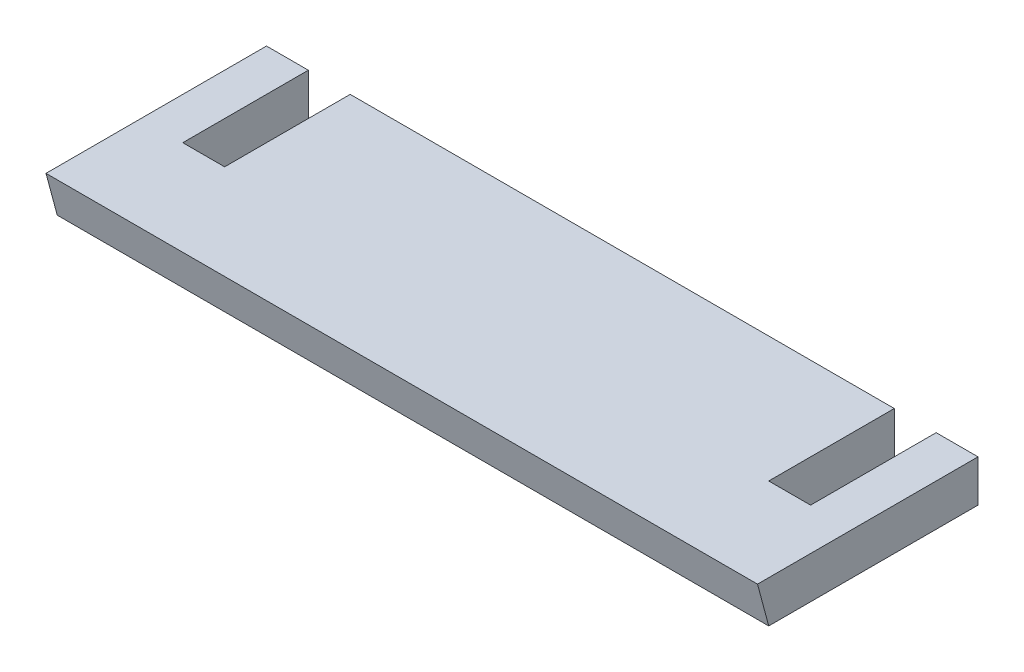
ISO-10303-21;
HEADER;
FILE_DESCRIPTION(('STEP AP214'),'2;1');
FILE_NAME('part.step','',(''),(''),'','','');
FILE_SCHEMA(('AUTOMOTIVE_DESIGN { 1 0 10303 214 1 1 1 1 }'));
ENDSEC;
DATA;
#1=APPLICATION_CONTEXT('core data for automotive mechanical design processes');
#2=APPLICATION_PROTOCOL_DEFINITION('international standard','automotive_design',2000,#1);
#3=PRODUCT_CONTEXT('',#1,'mechanical');
#4=PRODUCT('Part','Part','',(#3));
#5=PRODUCT_RELATED_PRODUCT_CATEGORY('part','',(#4));
#6=PRODUCT_DEFINITION_FORMATION('','',#4);
#7=PRODUCT_DEFINITION_CONTEXT('part definition',#1,'design');
#8=PRODUCT_DEFINITION('design','',#6,#7);
#9=PRODUCT_DEFINITION_SHAPE('','',#8);
#10=(LENGTH_UNIT() NAMED_UNIT(*) SI_UNIT(.MILLI.,.METRE.));
#11=(NAMED_UNIT(*) PLANE_ANGLE_UNIT() SI_UNIT($,.RADIAN.));
#12=(NAMED_UNIT(*) SI_UNIT($,.STERADIAN.) SOLID_ANGLE_UNIT());
#13=UNCERTAINTY_MEASURE_WITH_UNIT(LENGTH_MEASURE(1.E-05),#10,'distance_accuracy_value','');
#14=(GEOMETRIC_REPRESENTATION_CONTEXT(3) GLOBAL_UNCERTAINTY_ASSIGNED_CONTEXT((#13)) GLOBAL_UNIT_ASSIGNED_CONTEXT((#10,
#11,#12)) REPRESENTATION_CONTEXT('',''));
#15=CARTESIAN_POINT('',(0.,0.,0.));
#16=DIRECTION('',(0.,0.,1.));
#17=DIRECTION('',(1.,0.,0.));
#18=AXIS2_PLACEMENT_3D('',#15,#16,#17);
#19=CARTESIAN_POINT('',(-75.,10.,-25.));
#20=DIRECTION('',(0.,0.,1.));
#21=DIRECTION('',(1.,0.,0.));
#22=AXIS2_PLACEMENT_3D('',#19,#20,#21);
#23=PLANE('',#22);
#24=DIRECTION('',(-1.,0.,0.));
#25=VECTOR('',#24,1.);
#26=CARTESIAN_POINT('',(-75.,0.,-25.));
#27=LINE('',#26,#25);
#28=CARTESIAN_POINT('',(-75.,0.,-25.));
#29=VERTEX_POINT('',#28);
#30=CARTESIAN_POINT('',(-85.,0.,-25.));
#31=VERTEX_POINT('',#30);
#32=EDGE_CURVE('E162',#29,#31,#27,.T.);
#33=ORIENTED_EDGE('',*,*,#32,.T.);
#34=DIRECTION('',(0.,-1.,0.));
#35=VECTOR('',#34,1.);
#36=CARTESIAN_POINT('',(-85.,10.,-25.));
#37=LINE('',#36,#35);
#38=CARTESIAN_POINT('',(-85.,10.,-25.));
#39=VERTEX_POINT('',#38);
#40=EDGE_CURVE('E11',#39,#31,#37,.T.);
#41=ORIENTED_EDGE('',*,*,#40,.F.);
#42=DIRECTION('',(-1.,0.,0.));
#43=VECTOR('',#42,1.);
#44=CARTESIAN_POINT('',(-75.,10.,-25.));
#45=LINE('',#44,#43);
#46=CARTESIAN_POINT('',(-75.,10.,-25.));
#47=VERTEX_POINT('',#46);
#48=EDGE_CURVE('E198',#47,#39,#45,.T.);
#49=ORIENTED_EDGE('',*,*,#48,.F.);
#50=DIRECTION('',(0.,-1.,0.));
#51=VECTOR('',#50,1.);
#52=CARTESIAN_POINT('',(-75.,10.,-25.));
#53=LINE('',#52,#51);
#54=EDGE_CURVE('E158',#47,#29,#53,.T.);
#55=ORIENTED_EDGE('',*,*,#54,.T.);
#56=EDGE_LOOP('',(#33,#41,#49,#55));
#57=FACE_BOUND('',#56,.T.);
#58=ADVANCED_FACE('F39',(#57),#23,.F.);
#59=CARTESIAN_POINT('',(-85.,10.,25.));
#60=DIRECTION('',(1.,0.,0.));
#61=DIRECTION('',(0.,0.,-1.));
#62=AXIS2_PLACEMENT_3D('',#59,#60,#61);
#63=PLANE('',#62);
#64=DIRECTION('',(0.,0.,1.));
#65=VECTOR('',#64,1.);
#66=CARTESIAN_POINT('',(-85.,0.,25.));
#67=LINE('',#66,#65);
#68=CARTESIAN_POINT('',(-85.,0.,25.));
#69=VERTEX_POINT('',#68);
#70=EDGE_CURVE('E166',#31,#69,#67,.T.);
#71=ORIENTED_EDGE('',*,*,#70,.T.);
#72=DIRECTION('',(0.,0.965925826289068,0.258819045102521));
#73=VECTOR('',#72,1.);
#74=CARTESIAN_POINT('',(-85.,0.,25.));
#75=LINE('',#74,#73);
#76=CARTESIAN_POINT('',(-85.,10.,27.6794919243112));
#77=VERTEX_POINT('',#76);
#78=EDGE_CURVE('E50',#77,#69,#75,.F.);
#79=ORIENTED_EDGE('',*,*,#78,.F.);
#80=DIRECTION('',(0.,0.,1.));
#81=VECTOR('',#80,1.);
#82=CARTESIAN_POINT('',(-85.,10.,25.));
#83=LINE('',#82,#81);
#84=EDGE_CURVE('E105',#39,#77,#83,.T.);
#85=ORIENTED_EDGE('',*,*,#84,.F.);
#86=ORIENTED_EDGE('',*,*,#40,.T.);
#87=EDGE_LOOP('',(#71,#79,#85,#86));
#88=FACE_BOUND('',#87,.T.);
#89=ADVANCED_FACE('F271',(#88),#63,.F.);
#90=CARTESIAN_POINT('',(85.,0.,25.));
#91=DIRECTION('',(0.,-0.258819045102521,0.965925826289068));
#92=DIRECTION('',(0.,-0.965925826289068,-0.258819045102521));
#93=AXIS2_PLACEMENT_3D('',#90,#91,#92);
#94=PLANE('',#93);
#95=DIRECTION('',(1.,0.,0.));
#96=VECTOR('',#95,1.);
#97=CARTESIAN_POINT('',(85.,0.,25.));
#98=LINE('',#97,#96);
#99=CARTESIAN_POINT('',(85.,0.,25.));
#100=VERTEX_POINT('',#99);
#101=EDGE_CURVE('E169',#69,#100,#98,.T.);
#102=ORIENTED_EDGE('',*,*,#101,.T.);
#103=DIRECTION('',(0.,0.965925826289068,0.258819045102521));
#104=VECTOR('',#103,1.);
#105=CARTESIAN_POINT('',(85.,9.33012701892219,27.5));
#106=LINE('',#105,#104);
#107=CARTESIAN_POINT('',(85.,10.,27.6794919243112));
#108=VERTEX_POINT('',#107);
#109=EDGE_CURVE('E43',#108,#100,#106,.F.);
#110=ORIENTED_EDGE('',*,*,#109,.F.);
#111=DIRECTION('',(-1.,0.,0.));
#112=VECTOR('',#111,1.);
#113=CARTESIAN_POINT('',(0.,10.,27.6794919243112));
#114=LINE('',#113,#112);
#115=EDGE_CURVE('E228',#77,#108,#114,.F.);
#116=ORIENTED_EDGE('',*,*,#115,.F.);
#117=ORIENTED_EDGE('',*,*,#78,.T.);
#118=EDGE_LOOP('',(#102,#110,#116,#117));
#119=FACE_BOUND('',#118,.T.);
#120=ADVANCED_FACE('F41',(#119),#94,.T.);
#121=CARTESIAN_POINT('',(85.,10.,25.));
#122=DIRECTION('',(-1.,0.,0.));
#123=DIRECTION('',(0.,0.,1.));
#124=AXIS2_PLACEMENT_3D('',#121,#122,#123);
#125=PLANE('',#124);
#126=DIRECTION('',(0.,0.,-1.));
#127=VECTOR('',#126,1.);
#128=CARTESIAN_POINT('',(85.,0.,25.));
#129=LINE('',#128,#127);
#130=CARTESIAN_POINT('',(85.,0.,-25.));
#131=VERTEX_POINT('',#130);
#132=EDGE_CURVE('E172',#100,#131,#129,.T.);
#133=ORIENTED_EDGE('',*,*,#132,.T.);
#134=DIRECTION('',(0.,-1.,0.));
#135=VECTOR('',#134,1.);
#136=CARTESIAN_POINT('',(85.,10.,-25.));
#137=LINE('',#136,#135);
#138=CARTESIAN_POINT('',(85.,10.,-25.));
#139=VERTEX_POINT('',#138);
#140=EDGE_CURVE('E222',#139,#131,#137,.T.);
#141=ORIENTED_EDGE('',*,*,#140,.F.);
#142=DIRECTION('',(0.,0.,-1.));
#143=VECTOR('',#142,1.);
#144=CARTESIAN_POINT('',(85.,10.,25.));
#145=LINE('',#144,#143);
#146=EDGE_CURVE('E230',#108,#139,#145,.T.);
#147=ORIENTED_EDGE('',*,*,#146,.F.);
#148=ORIENTED_EDGE('',*,*,#109,.T.);
#149=EDGE_LOOP('',(#133,#141,#147,#148));
#150=FACE_BOUND('',#149,.T.);
#151=ADVANCED_FACE('F280',(#150),#125,.F.);
#152=CARTESIAN_POINT('',(85.,10.,-25.));
#153=DIRECTION('',(0.,0.,1.));
#154=DIRECTION('',(1.,0.,0.));
#155=AXIS2_PLACEMENT_3D('',#152,#153,#154);
#156=PLANE('',#155);
#157=DIRECTION('',(-1.,0.,0.));
#158=VECTOR('',#157,1.);
#159=CARTESIAN_POINT('',(85.,0.,-25.));
#160=LINE('',#159,#158);
#161=CARTESIAN_POINT('',(75.,0.,-25.));
#162=VERTEX_POINT('',#161);
#163=EDGE_CURVE('E175',#131,#162,#160,.T.);
#164=ORIENTED_EDGE('',*,*,#163,.T.);
#165=DIRECTION('',(0.,-1.,0.));
#166=VECTOR('',#165,1.);
#167=CARTESIAN_POINT('',(75.,10.,-25.));
#168=LINE('',#167,#166);
#169=CARTESIAN_POINT('',(75.,10.,-25.));
#170=VERTEX_POINT('',#169);
#171=EDGE_CURVE('E218',#170,#162,#168,.T.);
#172=ORIENTED_EDGE('',*,*,#171,.F.);
#173=DIRECTION('',(-1.,0.,0.));
#174=VECTOR('',#173,1.);
#175=CARTESIAN_POINT('',(85.,10.,-25.));
#176=LINE('',#175,#174);
#177=EDGE_CURVE('E235',#139,#170,#176,.T.);
#178=ORIENTED_EDGE('',*,*,#177,.F.);
#179=ORIENTED_EDGE('',*,*,#140,.T.);
#180=EDGE_LOOP('',(#164,#172,#178,#179));
#181=FACE_BOUND('',#180,.T.);
#182=ADVANCED_FACE('F284',(#181),#156,.F.);
#183=CARTESIAN_POINT('',(75.,10.,-25.));
#184=DIRECTION('',(1.,0.,0.));
#185=DIRECTION('',(0.,0.,-1.));
#186=AXIS2_PLACEMENT_3D('',#183,#184,#185);
#187=PLANE('',#186);
#188=DIRECTION('',(0.,0.,1.));
#189=VECTOR('',#188,1.);
#190=CARTESIAN_POINT('',(75.,0.,-25.));
#191=LINE('',#190,#189);
#192=CARTESIAN_POINT('',(75.,0.,5.));
#193=VERTEX_POINT('',#192);
#194=EDGE_CURVE('E178',#162,#193,#191,.T.);
#195=ORIENTED_EDGE('',*,*,#194,.T.);
#196=DIRECTION('',(0.,-1.,0.));
#197=VECTOR('',#196,1.);
#198=CARTESIAN_POINT('',(75.,10.,5.));
#199=LINE('',#198,#197);
#200=CARTESIAN_POINT('',(75.,10.,5.));
#201=VERTEX_POINT('',#200);
#202=EDGE_CURVE('E214',#201,#193,#199,.T.);
#203=ORIENTED_EDGE('',*,*,#202,.F.);
#204=DIRECTION('',(0.,0.,1.));
#205=VECTOR('',#204,1.);
#206=CARTESIAN_POINT('',(75.,10.,-25.));
#207=LINE('',#206,#205);
#208=EDGE_CURVE('E243',#170,#201,#207,.T.);
#209=ORIENTED_EDGE('',*,*,#208,.F.);
#210=ORIENTED_EDGE('',*,*,#171,.T.);
#211=EDGE_LOOP('',(#195,#203,#209,#210));
#212=FACE_BOUND('',#211,.T.);
#213=ADVANCED_FACE('F289',(#212),#187,.F.);
#214=CARTESIAN_POINT('',(75.,10.,5.));
#215=DIRECTION('',(0.,0.,1.));
#216=DIRECTION('',(1.,0.,0.));
#217=AXIS2_PLACEMENT_3D('',#214,#215,#216);
#218=PLANE('',#217);
#219=DIRECTION('',(-1.,0.,0.));
#220=VECTOR('',#219,1.);
#221=CARTESIAN_POINT('',(75.,0.,5.));
#222=LINE('',#221,#220);
#223=CARTESIAN_POINT('',(65.,0.,5.));
#224=VERTEX_POINT('',#223);
#225=EDGE_CURVE('E181',#193,#224,#222,.T.);
#226=ORIENTED_EDGE('',*,*,#225,.T.);
#227=DIRECTION('',(0.,-1.,0.));
#228=VECTOR('',#227,1.);
#229=CARTESIAN_POINT('',(65.,10.,5.));
#230=LINE('',#229,#228);
#231=CARTESIAN_POINT('',(65.,10.,5.));
#232=VERTEX_POINT('',#231);
#233=EDGE_CURVE('E210',#232,#224,#230,.T.);
#234=ORIENTED_EDGE('',*,*,#233,.F.);
#235=DIRECTION('',(-1.,0.,0.));
#236=VECTOR('',#235,1.);
#237=CARTESIAN_POINT('',(75.,10.,5.));
#238=LINE('',#237,#236);
#239=EDGE_CURVE('E246',#201,#232,#238,.T.);
#240=ORIENTED_EDGE('',*,*,#239,.F.);
#241=ORIENTED_EDGE('',*,*,#202,.T.);
#242=EDGE_LOOP('',(#226,#234,#240,#241));
#243=FACE_BOUND('',#242,.T.);
#244=ADVANCED_FACE('F292',(#243),#218,.F.);
#245=CARTESIAN_POINT('',(65.,10.,5.));
#246=DIRECTION('',(-1.,0.,0.));
#247=DIRECTION('',(0.,0.,1.));
#248=AXIS2_PLACEMENT_3D('',#245,#246,#247);
#249=PLANE('',#248);
#250=DIRECTION('',(0.,0.,-1.));
#251=VECTOR('',#250,1.);
#252=CARTESIAN_POINT('',(65.,0.,5.));
#253=LINE('',#252,#251);
#254=CARTESIAN_POINT('',(65.,0.,-25.));
#255=VERTEX_POINT('',#254);
#256=EDGE_CURVE('E184',#224,#255,#253,.T.);
#257=ORIENTED_EDGE('',*,*,#256,.T.);
#258=DIRECTION('',(0.,-1.,0.));
#259=VECTOR('',#258,1.);
#260=CARTESIAN_POINT('',(65.,10.,-25.));
#261=LINE('',#260,#259);
#262=CARTESIAN_POINT('',(65.,10.,-25.));
#263=VERTEX_POINT('',#262);
#264=EDGE_CURVE('E206',#263,#255,#261,.T.);
#265=ORIENTED_EDGE('',*,*,#264,.F.);
#266=DIRECTION('',(0.,0.,-1.));
#267=VECTOR('',#266,1.);
#268=CARTESIAN_POINT('',(65.,10.,5.));
#269=LINE('',#268,#267);
#270=EDGE_CURVE('E249',#232,#263,#269,.T.);
#271=ORIENTED_EDGE('',*,*,#270,.F.);
#272=ORIENTED_EDGE('',*,*,#233,.T.);
#273=EDGE_LOOP('',(#257,#265,#271,#272));
#274=FACE_BOUND('',#273,.T.);
#275=ADVANCED_FACE('F257',(#274),#249,.F.);
#276=CARTESIAN_POINT('',(65.,10.,-25.));
#277=DIRECTION('',(0.,0.,1.));
#278=DIRECTION('',(1.,0.,0.));
#279=AXIS2_PLACEMENT_3D('',#276,#277,#278);
#280=PLANE('',#279);
#281=DIRECTION('',(-1.,0.,0.));
#282=VECTOR('',#281,1.);
#283=CARTESIAN_POINT('',(65.,0.,-25.));
#284=LINE('',#283,#282);
#285=CARTESIAN_POINT('',(-65.,0.,-25.));
#286=VERTEX_POINT('',#285);
#287=EDGE_CURVE('E187',#255,#286,#284,.T.);
#288=ORIENTED_EDGE('',*,*,#287,.T.);
#289=DIRECTION('',(0.,-1.,0.));
#290=VECTOR('',#289,1.);
#291=CARTESIAN_POINT('',(-65.,10.,-25.));
#292=LINE('',#291,#290);
#293=CARTESIAN_POINT('',(-65.,10.,-25.));
#294=VERTEX_POINT('',#293);
#295=EDGE_CURVE('E150',#294,#286,#292,.T.);
#296=ORIENTED_EDGE('',*,*,#295,.F.);
#297=DIRECTION('',(-1.,0.,0.));
#298=VECTOR('',#297,1.);
#299=CARTESIAN_POINT('',(65.,10.,-25.));
#300=LINE('',#299,#298);
#301=EDGE_CURVE('E136',#263,#294,#300,.T.);
#302=ORIENTED_EDGE('',*,*,#301,.F.);
#303=ORIENTED_EDGE('',*,*,#264,.T.);
#304=EDGE_LOOP('',(#288,#296,#302,#303));
#305=FACE_BOUND('',#304,.T.);
#306=ADVANCED_FACE('F261',(#305),#280,.F.);
#307=CARTESIAN_POINT('',(-65.,10.,5.));
#308=DIRECTION('',(1.,0.,0.));
#309=DIRECTION('',(0.,0.,-1.));
#310=AXIS2_PLACEMENT_3D('',#307,#308,#309);
#311=PLANE('',#310);
#312=DIRECTION('',(0.,0.,1.));
#313=VECTOR('',#312,1.);
#314=CARTESIAN_POINT('',(-65.,0.,5.));
#315=LINE('',#314,#313);
#316=CARTESIAN_POINT('',(-65.,0.,5.));
#317=VERTEX_POINT('',#316);
#318=EDGE_CURVE('E146',#286,#317,#315,.T.);
#319=ORIENTED_EDGE('',*,*,#318,.T.);
#320=DIRECTION('',(0.,-1.,0.));
#321=VECTOR('',#320,1.);
#322=CARTESIAN_POINT('',(-65.,10.,5.));
#323=LINE('',#322,#321);
#324=CARTESIAN_POINT('',(-65.,10.,5.));
#325=VERTEX_POINT('',#324);
#326=EDGE_CURVE('E143',#325,#317,#323,.T.);
#327=ORIENTED_EDGE('',*,*,#326,.F.);
#328=DIRECTION('',(0.,0.,1.));
#329=VECTOR('',#328,1.);
#330=CARTESIAN_POINT('',(-65.,10.,5.));
#331=LINE('',#330,#329);
#332=EDGE_CURVE('E129',#294,#325,#331,.T.);
#333=ORIENTED_EDGE('',*,*,#332,.F.);
#334=ORIENTED_EDGE('',*,*,#295,.T.);
#335=EDGE_LOOP('',(#319,#327,#333,#334));
#336=FACE_BOUND('',#335,.T.);
#337=ADVANCED_FACE('F144',(#336),#311,.F.);
#338=CARTESIAN_POINT('',(-75.,10.,5.));
#339=DIRECTION('',(0.,0.,1.));
#340=DIRECTION('',(1.,0.,0.));
#341=AXIS2_PLACEMENT_3D('',#338,#339,#340);
#342=PLANE('',#341);
#343=DIRECTION('',(-1.,0.,0.));
#344=VECTOR('',#343,1.);
#345=CARTESIAN_POINT('',(-75.,0.,5.));
#346=LINE('',#345,#344);
#347=CARTESIAN_POINT('',(-75.,0.,5.));
#348=VERTEX_POINT('',#347);
#349=EDGE_CURVE('E192',#317,#348,#346,.T.);
#350=ORIENTED_EDGE('',*,*,#349,.T.);
#351=DIRECTION('',(0.,-1.,0.));
#352=VECTOR('',#351,1.);
#353=CARTESIAN_POINT('',(-75.,10.,5.));
#354=LINE('',#353,#352);
#355=CARTESIAN_POINT('',(-75.,10.,5.));
#356=VERTEX_POINT('',#355);
#357=EDGE_CURVE('E151',#356,#348,#354,.T.);
#358=ORIENTED_EDGE('',*,*,#357,.F.);
#359=DIRECTION('',(-1.,0.,0.));
#360=VECTOR('',#359,1.);
#361=CARTESIAN_POINT('',(-75.,10.,5.));
#362=LINE('',#361,#360);
#363=EDGE_CURVE('E133',#325,#356,#362,.T.);
#364=ORIENTED_EDGE('',*,*,#363,.F.);
#365=ORIENTED_EDGE('',*,*,#326,.T.);
#366=EDGE_LOOP('',(#350,#358,#364,#365));
#367=FACE_BOUND('',#366,.T.);
#368=ADVANCED_FACE('F153',(#367),#342,.F.);
#369=CARTESIAN_POINT('',(-75.,10.,-25.));
#370=DIRECTION('',(-1.,0.,0.));
#371=DIRECTION('',(0.,0.,1.));
#372=AXIS2_PLACEMENT_3D('',#369,#370,#371);
#373=PLANE('',#372);
#374=DIRECTION('',(0.,0.,-1.));
#375=VECTOR('',#374,1.);
#376=CARTESIAN_POINT('',(-75.,0.,-25.));
#377=LINE('',#376,#375);
#378=EDGE_CURVE('E195',#348,#29,#377,.T.);
#379=ORIENTED_EDGE('',*,*,#378,.T.);
#380=ORIENTED_EDGE('',*,*,#54,.F.);
#381=DIRECTION('',(0.,0.,-1.));
#382=VECTOR('',#381,1.);
#383=CARTESIAN_POINT('',(-75.,10.,-25.));
#384=LINE('',#383,#382);
#385=EDGE_CURVE('E59',#356,#47,#384,.T.);
#386=ORIENTED_EDGE('',*,*,#385,.F.);
#387=ORIENTED_EDGE('',*,*,#357,.T.);
#388=EDGE_LOOP('',(#379,#380,#386,#387));
#389=FACE_BOUND('',#388,.T.);
#390=ADVANCED_FACE('F267',(#389),#373,.F.);
#391=CARTESIAN_POINT('',(0.,10.,0.));
#392=DIRECTION('',(0.,-1.,0.));
#393=DIRECTION('',(0.,0.,-1.));
#394=AXIS2_PLACEMENT_3D('',#391,#392,#393);
#395=PLANE('',#394);
#396=ORIENTED_EDGE('',*,*,#48,.T.);
#397=ORIENTED_EDGE('',*,*,#84,.T.);
#398=ORIENTED_EDGE('',*,*,#115,.T.);
#399=ORIENTED_EDGE('',*,*,#146,.T.);
#400=ORIENTED_EDGE('',*,*,#177,.T.);
#401=ORIENTED_EDGE('',*,*,#208,.T.);
#402=ORIENTED_EDGE('',*,*,#239,.T.);
#403=ORIENTED_EDGE('',*,*,#270,.T.);
#404=ORIENTED_EDGE('',*,*,#301,.T.);
#405=ORIENTED_EDGE('',*,*,#332,.T.);
#406=ORIENTED_EDGE('',*,*,#363,.T.);
#407=ORIENTED_EDGE('',*,*,#385,.T.);
#408=EDGE_LOOP('',(#396,#397,#398,#399,#400,#401,#402,#403,#404,#405,#406,#407));
#409=FACE_BOUND('',#408,.T.);
#410=ADVANCED_FACE('F131',(#409),#395,.F.);
#411=CARTESIAN_POINT('',(0.,0.,0.));
#412=DIRECTION('',(0.,-1.,0.));
#413=DIRECTION('',(0.,0.,-1.));
#414=AXIS2_PLACEMENT_3D('',#411,#412,#413);
#415=PLANE('',#414);
#416=ORIENTED_EDGE('',*,*,#32,.F.);
#417=ORIENTED_EDGE('',*,*,#378,.F.);
#418=ORIENTED_EDGE('',*,*,#349,.F.);
#419=ORIENTED_EDGE('',*,*,#318,.F.);
#420=ORIENTED_EDGE('',*,*,#287,.F.);
#421=ORIENTED_EDGE('',*,*,#256,.F.);
#422=ORIENTED_EDGE('',*,*,#225,.F.);
#423=ORIENTED_EDGE('',*,*,#194,.F.);
#424=ORIENTED_EDGE('',*,*,#163,.F.);
#425=ORIENTED_EDGE('',*,*,#132,.F.);
#426=ORIENTED_EDGE('',*,*,#101,.F.);
#427=ORIENTED_EDGE('',*,*,#70,.F.);
#428=EDGE_LOOP('',(#416,#417,#418,#419,#420,#421,#422,#423,#424,#425,#426,#427));
#429=FACE_BOUND('',#428,.T.);
#430=ADVANCED_FACE('F264',(#429),#415,.T.);
#431=CLOSED_SHELL('',(#58,#89,#120,#151,#182,#213,#244,#275,#306,#337,#368,#390,#410,#430));
#432=MANIFOLD_SOLID_BREP('B2',#431);
#433=ADVANCED_BREP_SHAPE_REPRESENTATION('',(#18,#432),#14);
#434=SHAPE_DEFINITION_REPRESENTATION(#9,#433);
ENDSEC;
END-ISO-10303-21;
